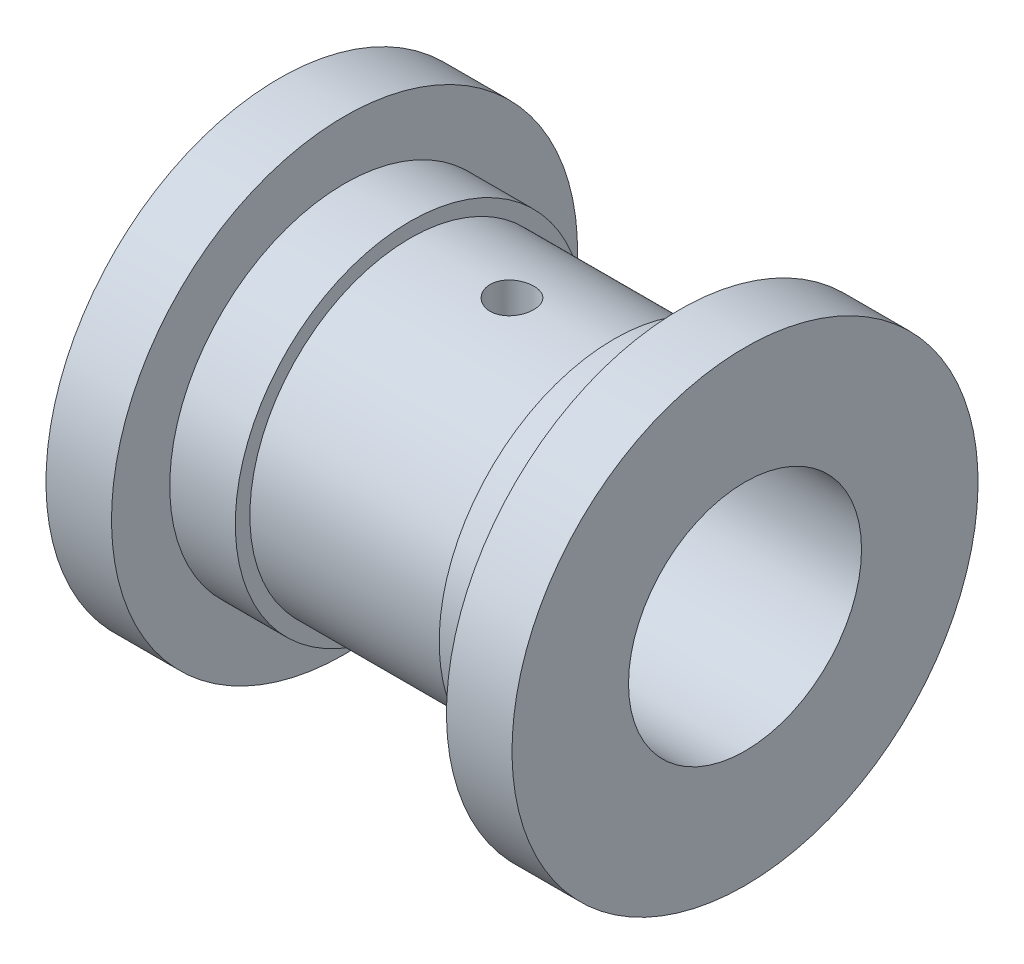
ISO-10303-21;
HEADER;
FILE_DESCRIPTION(('STEP AP214'),'2;1');
FILE_NAME('part.step','',(''),(''),'','','');
FILE_SCHEMA(('AUTOMOTIVE_DESIGN { 1 0 10303 214 1 1 1 1 }'));
ENDSEC;
DATA;
#1=APPLICATION_CONTEXT('core data for automotive mechanical design processes');
#2=APPLICATION_PROTOCOL_DEFINITION('international standard','automotive_design',2000,#1);
#3=PRODUCT_CONTEXT('',#1,'mechanical');
#4=PRODUCT('Part','Part','',(#3));
#5=PRODUCT_RELATED_PRODUCT_CATEGORY('part','',(#4));
#6=PRODUCT_DEFINITION_FORMATION('','',#4);
#7=PRODUCT_DEFINITION_CONTEXT('part definition',#1,'design');
#8=PRODUCT_DEFINITION('design','',#6,#7);
#9=PRODUCT_DEFINITION_SHAPE('','',#8);
#10=(LENGTH_UNIT() NAMED_UNIT(*) SI_UNIT(.MILLI.,.METRE.));
#11=(NAMED_UNIT(*) PLANE_ANGLE_UNIT() SI_UNIT($,.RADIAN.));
#12=(NAMED_UNIT(*) SI_UNIT($,.STERADIAN.) SOLID_ANGLE_UNIT());
#13=UNCERTAINTY_MEASURE_WITH_UNIT(LENGTH_MEASURE(1.E-05),#10,'distance_accuracy_value','');
#14=(GEOMETRIC_REPRESENTATION_CONTEXT(3) GLOBAL_UNCERTAINTY_ASSIGNED_CONTEXT((#13)) GLOBAL_UNIT_ASSIGNED_CONTEXT((#10,
#11,#12)) REPRESENTATION_CONTEXT('',''));
#15=CARTESIAN_POINT('',(0.,0.,0.));
#16=DIRECTION('',(0.,0.,1.));
#17=DIRECTION('',(1.,0.,0.));
#18=AXIS2_PLACEMENT_3D('',#15,#16,#17);
#19=CARTESIAN_POINT('',(-82.8027204836415,0.,0.));
#20=DIRECTION('',(-1.,0.,0.));
#21=DIRECTION('',(0.,-1.,0.));
#22=AXIS2_PLACEMENT_3D('',#19,#20,#21);
#23=CYLINDRICAL_SURFACE('',#22,16.);
#24=CARTESIAN_POINT('',(3.,-16.,0.));
#25=CARTESIAN_POINT('',(2.99999362082345,-15.999996976677,0.166943492930942));
#26=CARTESIAN_POINT('',(2.98601784676124,-15.9973601984342,0.333969985460197));
#27=CARTESIAN_POINT('',(2.93052000976331,-15.9870957178104,0.663316259683595));
#28=CARTESIAN_POINT('',(2.88897469872053,-15.9794638033379,0.825631948304451));
#29=CARTESIAN_POINT('',(2.77965459748132,-15.9600627753091,1.1407459237036));
#30=CARTESIAN_POINT('',(2.71190349509491,-15.9482973989296,1.29355266137069));
#31=CARTESIAN_POINT('',(2.55216224615437,-15.9219142119956,1.58561594618801));
#32=CARTESIAN_POINT('',(2.46017406171036,-15.9072966323658,1.72487358895465));
#33=CARTESIAN_POINT('',(2.25340046399265,-15.87662672861,1.98756743186101));
#34=CARTESIAN_POINT('',(2.13838111065973,-15.860560697127,2.11081791006366));
#35=CARTESIAN_POINT('',(1.88931338182488,-15.828906369173,2.33639212270738));
#36=CARTESIAN_POINT('',(1.75526364046143,-15.8133181070905,2.43871435378483));
#37=CARTESIAN_POINT('',(1.47062782327206,-15.7842510249001,2.62029997331586));
#38=CARTESIAN_POINT('',(1.31991925936553,-15.7707898777236,2.69937443939211));
#39=CARTESIAN_POINT('',(1.00706216964642,-15.7476942642397,2.83101048664566));
#40=CARTESIAN_POINT('',(0.844914631777566,-15.7380594679392,2.88357435426196));
#41=CARTESIAN_POINT('',(0.515769538171177,-15.723845391491,2.96010107007));
#42=CARTESIAN_POINT('',(0.348849805593071,-15.7192089073281,2.98438780384078));
#43=CARTESIAN_POINT('',(0.0132452303835036,-15.7153439430552,3.00467616190693));
#44=CARTESIAN_POINT('',(-0.155439452604603,-15.7161149779752,3.00068032270748));
#45=CARTESIAN_POINT('',(-0.487439050532092,-15.722925854035,2.96477959204725));
#46=CARTESIAN_POINT('',(-0.650795428600308,-15.7288961629466,2.9332429999209));
#47=CARTESIAN_POINT('',(-0.969856839565217,-15.7453236656933,2.84373598792414));
#48=CARTESIAN_POINT('',(-1.1255615470186,-15.7557810501903,2.78576444478999));
#49=CARTESIAN_POINT('',(-1.42597735800053,-15.7800771058517,2.644672943586));
#50=CARTESIAN_POINT('',(-1.57061694116162,-15.7939356764673,2.56140427064912));
#51=CARTESIAN_POINT('',(-1.84400945708047,-15.8234594320583,2.37218737860832));
#52=CARTESIAN_POINT('',(-1.9727607754296,-15.8391248003104,2.26623685778532));
#53=CARTESIAN_POINT('',(-2.21284991134492,-15.8708000254432,2.03267811370595));
#54=CARTESIAN_POINT('',(-2.32388130490348,-15.8868114204806,1.90475487372136));
#55=CARTESIAN_POINT('',(-2.52295448135081,-15.9171477221663,1.63193607419765));
#56=CARTESIAN_POINT('',(-2.61099603374084,-15.9314726119049,1.48704034451154));
#57=CARTESIAN_POINT('',(-2.76163550774003,-15.9568507935501,1.18406997774934));
#58=CARTESIAN_POINT('',(-2.82420155823579,-15.9678999827257,1.02597912889299));
#59=CARTESIAN_POINT('',(-2.92180418618432,-15.9854501080544,0.701278230797393));
#60=CARTESIAN_POINT('',(-2.95684368809071,-15.9919515273598,0.534669088555574));
#61=CARTESIAN_POINT('',(-2.99797206203654,-15.9996072128396,0.20029730580677));
#62=CARTESIAN_POINT('',(-3.00448078305945,-16.0008390182455,0.0325880252682708));
#63=CARTESIAN_POINT('',(-2.9894890409047,-15.9980308719645,-0.301522496184368));
#64=CARTESIAN_POINT('',(-2.96798995386948,-15.9939911792886,-0.46792380096077));
#65=CARTESIAN_POINT('',(-2.89794192963326,-15.9811422300081,-0.793363146436434));
#66=CARTESIAN_POINT('',(-2.84960543492437,-15.9723704474806,-0.952448522092126));
#67=CARTESIAN_POINT('',(-2.72748458644243,-15.9510368442499,-1.26025726364926));
#68=CARTESIAN_POINT('',(-2.65369850486843,-15.9384747662266,-1.40897992519021));
#69=CARTESIAN_POINT('',(-2.48184374368098,-15.9107606071533,-1.69363334302643));
#70=CARTESIAN_POINT('',(-2.38351852292632,-15.8955817234912,-1.82940655403024));
#71=CARTESIAN_POINT('',(-2.16572372527528,-15.8643868697942,-2.08267664652909));
#72=CARTESIAN_POINT('',(-2.04625217399734,-15.8483708216937,-2.20017181952173));
#73=CARTESIAN_POINT('',(-1.78765536217715,-15.817049513949,-2.41514591744096));
#74=CARTESIAN_POINT('',(-1.64829018374923,-15.8017565172051,-2.51233832437153));
#75=CARTESIAN_POINT('',(-1.3549647509525,-15.7738597115706,-2.68193350115574));
#76=CARTESIAN_POINT('',(-1.20100503925905,-15.761255802747,-2.75433719227848));
#77=CARTESIAN_POINT('',(-0.883588265514928,-15.7402604841914,-2.87189347025646));
#78=CARTESIAN_POINT('',(-0.720181240881335,-15.7318488087375,-2.91717737589573));
#79=CARTESIAN_POINT('',(-0.387905554957197,-15.7201440760483,-2.97961358652471));
#80=CARTESIAN_POINT('',(-0.219037512059197,-15.7168504413158,-2.99676906541416));
#81=CARTESIAN_POINT('',(0.116496662883025,-15.7157839960771,-3.00235524296709));
#82=CARTESIAN_POINT('',(0.283155161913991,-15.7179243194858,-2.99123790006998));
#83=CARTESIAN_POINT('',(0.612182844090576,-15.7272920131999,-2.94158350757606));
#84=CARTESIAN_POINT('',(0.774552052854881,-15.7345193531149,-2.90304662178664));
#85=CARTESIAN_POINT('',(1.09014896959096,-15.7532101604636,-2.79983775166526));
#86=CARTESIAN_POINT('',(1.24339318269154,-15.7646656918993,-2.73521470794505));
#87=CARTESIAN_POINT('',(1.53693650848169,-15.7905277510368,-2.58171737824408));
#88=CARTESIAN_POINT('',(1.67723470568956,-15.8049344872024,-2.49284137896371));
#89=CARTESIAN_POINT('',(1.94316736008459,-15.8353453221549,-2.2917897467907));
#90=CARTESIAN_POINT('',(2.06855082513421,-15.8513701070608,-2.17928519728607));
#91=CARTESIAN_POINT('',(2.29881032492905,-15.8830566783747,-1.93485585348458));
#92=CARTESIAN_POINT('',(2.40368164196027,-15.8987183805465,-1.80292660378323));
#93=CARTESIAN_POINT('',(2.59082190525412,-15.9280795193609,-1.52196989014374));
#94=CARTESIAN_POINT('',(2.67287885698128,-15.9417600198112,-1.37279918128103));
#95=CARTESIAN_POINT('',(2.81063527321027,-15.9654323876137,-1.06258022730767));
#96=CARTESIAN_POINT('',(2.86635949409382,-15.9754277175807,-0.901543303410496));
#97=CARTESIAN_POINT('',(2.93855462883735,-15.9885658141526,-0.616694405650307));
#98=CARTESIAN_POINT('',(2.9615572606256,-15.9928294175641,-0.494547620503741));
#99=CARTESIAN_POINT('',(2.99228212423289,-15.9985475990802,-0.248282494230315));
#100=CARTESIAN_POINT('',(3.00000474451181,-16.0000022485961,-0.124164203305418));
#101=CARTESIAN_POINT('',(3.,-16.,0.));
#102=B_SPLINE_CURVE_WITH_KNOTS('',3,(#24,#25,#26,#27,#28,#29,#30,#31,#32,#33,#34,#35,#36,#37,
#38,#39,#40,#41,#42,#43,#44,#45,#46,#47,#48,#49,#50,#51,#52,#53,#54,#55,#56,#57,#58,#59,#60,#61,
#62,#63,#64,#65,#66,#67,#68,#69,#70,#71,#72,#73,#74,#75,#76,#77,#78,#79,#80,#81,#82,#83,#84,#85,
#86,#87,#88,#89,#90,#91,#92,#93,#94,#95,#96,#97,#98,#99,#100,#101),.UNSPECIFIED.,.T.,.F.,(4,2,2,
2,2,2,2,2,2,2,2,2,2,2,2,2,2,2,2,2,2,2,2,2,2,2,2,2,2,2,2,2,2,2,2,2,2,2,4),(0.,0.500376401929848,
1.0011752850709,1.50152254246181,2.00182930673781,2.50750236027261,3.01321172567233,
3.52292381008715,4.03259192623897,4.53636302890672,5.04008895174512,5.53718001225531,
6.03429219693573,6.53438525259061,7.03452908099719,7.54255536928154,8.05058675089895,
8.55925176643397,9.06786273347491,9.56896348152193,10.0700396092917,10.5672046781566,
11.0644035067606,11.5670355603542,12.069714568262,12.579068739746,13.0884039790989,
13.5952525563712,14.1020439389303,14.600785044635,15.0995231708301,15.5973299241539,
16.0951718531085,16.6004673993276,17.1058790252451,17.6158409783263,18.1253225386235,
18.4974868904882,18.8696417807908),.UNSPECIFIED.);
#103=CARTESIAN_POINT('',(3.,-16.,0.));
#104=VERTEX_POINT('',#103);
#105=EDGE_CURVE('E79',#104,#104,#102,.T.);
#106=ORIENTED_EDGE('',*,*,#105,.T.);
#107=EDGE_LOOP('',(#106));
#108=FACE_BOUND('',#107,.T.);
#109=CARTESIAN_POINT('',(0.,15.7162336455017,3.));
#110=CARTESIAN_POINT('',(0.166914416025241,15.7162368759014,2.99999359766589));
#111=CARTESIAN_POINT('',(0.333911896437253,15.7189215952138,2.98602252697898));
#112=CARTESIAN_POINT('',(0.663197923163344,15.7293570202788,2.93054506503584));
#113=CARTESIAN_POINT('',(0.825482352854829,15.7371120234618,2.88901531536947));
#114=CARTESIAN_POINT('',(1.14053014274188,15.7567795292999,2.77974071235582));
#115=CARTESIAN_POINT('',(1.29330221861461,15.7686881581205,2.7120202790875));
#116=CARTESIAN_POINT('',(1.58530711857359,15.7953165264186,2.5523513152073));
#117=CARTESIAN_POINT('',(1.72454099800659,15.8100360465123,2.46040467518386));
#118=CARTESIAN_POINT('',(1.98726039839827,15.840832296779,2.25367357885245));
#119=CARTESIAN_POINT('',(2.11055296694346,15.8569223325136,2.13864585866184));
#120=CARTESIAN_POINT('',(2.33620877919912,15.8885291532806,1.8895435576071));
#121=CARTESIAN_POINT('',(2.43857064884959,15.904045900623,1.75546772724989));
#122=CARTESIAN_POINT('',(2.62019875320103,15.9329003565681,1.47080778914033));
#123=CARTESIAN_POINT('',(2.69928306703884,15.9462205610473,1.32010568006773));
#124=CARTESIAN_POINT('',(2.83093908454706,15.9690321726586,1.00726256650152));
#125=CARTESIAN_POINT('',(2.88351296798044,15.9785238945667,0.845122503719011));
#126=CARTESIAN_POINT('',(2.96005909722227,15.9925151024756,0.516005492374832));
#127=CARTESIAN_POINT('',(2.98435661184537,15.9970713195265,0.349106646489714));
#128=CARTESIAN_POINT('',(3.0046737754008,16.0008736923119,0.0135433520707662));
#129=CARTESIAN_POINT('',(3.00069583227812,16.0001203002139,-0.15512094489534));
#130=CARTESIAN_POINT('',(2.9648244577057,15.9934326752648,-0.487196715798793));
#131=CARTESIAN_POINT('',(2.93328126113998,15.9875634449443,-0.650647520902939));
#132=CARTESIAN_POINT('',(2.84372870120953,15.9713765266712,-0.969894331430951));
#133=CARTESIAN_POINT('',(2.78571837330839,15.9610586765993,-1.12569005765308));
#134=CARTESIAN_POINT('',(2.6445445378834,15.9370252059468,-1.42622013150304));
#135=CARTESIAN_POINT('',(2.56124102417501,15.9232907518165,-1.57088714367707));
#136=CARTESIAN_POINT('',(2.37194866184569,15.893942950857,-1.84431995442927));
#137=CARTESIAN_POINT('',(2.26595750622484,15.8783294130233,-1.97308413382157));
#138=CARTESIAN_POINT('',(2.03236859403294,15.8466702736113,-2.21313123793807));
#139=CARTESIAN_POINT('',(1.90446443219585,15.8306217180324,-2.32411581514082));
#140=CARTESIAN_POINT('',(1.63170093744275,15.8001301784924,-2.52310343702521));
#141=CARTESIAN_POINT('',(1.48684135647073,15.785687218027,-2.61110614542364));
#142=CARTESIAN_POINT('',(1.18388345859468,15.7600378661424,-2.76171704448955));
#143=CARTESIAN_POINT('',(1.02576308561871,15.7488370106052,-2.82428187290843));
#144=CARTESIAN_POINT('',(0.700997631753599,15.7310248479338,-2.92187313950112));
#145=CARTESIAN_POINT('',(0.534353519070433,15.7244130207724,-2.95690269802216));
#146=CARTESIAN_POINT('',(0.199961342288244,15.7166304060201,-2.99799345299478));
#147=CARTESIAN_POINT('',(0.0322677688689722,15.7153791163227,-3.00448328571717));
#148=CARTESIAN_POINT('',(-0.301806910174295,15.7182438284168,-2.98945937763449));
#149=CARTESIAN_POINT('',(-0.468188080296165,15.7223595647722,-2.96794702172866));
#150=CARTESIAN_POINT('',(-0.793505806108774,15.7354196012641,-2.89789736391765));
#151=CARTESIAN_POINT('',(-0.952492505249789,15.7443237338176,-2.84958477167979));
#152=CARTESIAN_POINT('',(-1.26011437946031,15.7659226831324,-2.7275444875812));
#153=CARTESIAN_POINT('',(-1.40874879063066,15.7786177792656,-2.6538149225759));
#154=CARTESIAN_POINT('',(-1.69333523808634,15.8065515572737,-2.4820470623932));
#155=CARTESIAN_POINT('',(-1.82912107573214,15.8218179085063,-2.38373799279242));
#156=CARTESIAN_POINT('',(-2.08242408042866,15.853096227362,-2.16596688688493));
#157=CARTESIAN_POINT('',(-2.19993960311155,15.8691082619299,-2.04650294866167));
#158=CARTESIAN_POINT('',(-2.41496752706825,15.9003324801189,-1.78789883574077));
#159=CARTESIAN_POINT('',(-2.51219165321193,15.9155311166661,-1.64851706819178));
#160=CARTESIAN_POINT('',(-2.68184241235533,15.943188096207,-1.35514904608028));
#161=CARTESIAN_POINT('',(-2.75427000005001,15.9556465446945,-1.20116335407706));
#162=CARTESIAN_POINT('',(-2.87184019572816,15.9763611599169,-0.88375508315737));
#163=CARTESIAN_POINT('',(-2.91712437512282,15.9846390946028,-0.720386426157979));
#164=CARTESIAN_POINT('',(-2.97957409657977,15.9961528416749,-0.388192454763141));
#165=CARTESIAN_POINT('',(-2.99674259732541,15.9993891845988,-0.219367716431697));
#166=CARTESIAN_POINT('',(-3.0023706030369,16.0004445503086,0.116181520501011));
#167=CARTESIAN_POINT('',(-2.9912655062591,15.9983457325,0.282898614132513));
#168=CARTESIAN_POINT('',(-2.94161514446309,15.9891373322347,0.612046738558421));
#169=CARTESIAN_POINT('',(-2.90307014251143,15.9820277978157,0.774477810427461));
#170=CARTESIAN_POINT('',(-2.79981758523272,15.9635967595586,1.09021295119089));
#171=CARTESIAN_POINT('',(-2.73515637423856,15.9522827196228,1.24353263863614));
#172=CARTESIAN_POINT('',(-2.58155909268906,15.9266674413841,1.5372112626337));
#173=CARTESIAN_POINT('',(-2.49262139578454,15.912366002962,1.67756933000769));
#174=CARTESIAN_POINT('',(-2.29149709111754,15.882095597166,1.94351005555884));
#175=CARTESIAN_POINT('',(-2.17899593228479,15.8661056917023,2.06885247077667));
#176=CARTESIAN_POINT('',(-1.93459087500638,15.8343926708998,2.2990307213141));
#177=CARTESIAN_POINT('',(-1.80268241922192,15.8186696191953,2.403861726512));
#178=CARTESIAN_POINT('',(-1.52174709061987,15.7891115480538,2.59095267889405));
#179=CARTESIAN_POINT('',(-1.37257312077141,15.7752953438736,2.67299481058047));
#180=CARTESIAN_POINT('',(-1.06234842014791,15.7513416912985,2.81072264841151));
#181=CARTESIAN_POINT('',(-0.901309066849276,15.7412007725928,2.86643323276462));
#182=CARTESIAN_POINT('',(-0.616495423852269,15.7278603261272,2.9385945319323));
#183=CARTESIAN_POINT('',(-0.494388552471807,15.7235262144357,2.96158211479939));
#184=CARTESIAN_POINT('',(-0.248203063163672,15.7177117118331,2.99228702152192));
#185=CARTESIAN_POINT('',(-0.124124499000656,15.7162312432422,3.00000476104182));
#186=CARTESIAN_POINT('',(0.,15.7162336455017,3.));
#187=B_SPLINE_CURVE_WITH_KNOTS('',3,(#109,#110,#111,#112,#113,#114,#115,#116,#117,#118,#119,
#120,#121,#122,#123,#124,#125,#126,#127,#128,#129,#130,#131,#132,#133,#134,#135,#136,#137,#138,
#139,#140,#141,#142,#143,#144,#145,#146,#147,#148,#149,#150,#151,#152,#153,#154,#155,#156,#157,
#158,#159,#160,#161,#162,#163,#164,#165,#166,#167,#168,#169,#170,#171,#172,#173,#174,#175,#176,
#177,#178,#179,#180,#181,#182,#183,#184,#185,#186),.UNSPECIFIED.,.T.,.F.,(4,2,2,2,2,2,2,2,2,2,2,
2,2,2,2,2,2,2,2,2,2,2,2,2,2,2,2,2,2,2,2,2,2,2,2,2,2,2,4),(0.,0.500289011586373,1.00100260476079,
1.50125045595686,2.00145927987816,2.50724671397382,3.01306734138629,3.52274208696095,
4.03237491879281,4.53608550920522,5.03975320401296,5.53711301197449,6.03449094656849,
6.53467383968438,7.03490761823571,7.54281229528128,8.050724403848,8.55949872236533,
9.06821537732975,9.5692649717415,10.0702897867744,10.5671758463074,11.0640985324863,
11.5667572530829,12.0694611878935,12.5788825099174,13.0882842164341,13.5950053883737,
14.1016732333466,14.6005860114028,15.0994940064433,15.5975205306072,16.0955804271422,
16.6007692801749,17.1060769546153,17.6160600363782,18.1255603150176,18.4976061505795,
18.8696418584437),.UNSPECIFIED.);
#188=CARTESIAN_POINT('',(0.,15.7162336455017,3.));
#189=VERTEX_POINT('',#188);
#190=EDGE_CURVE('E84',#189,#189,#187,.T.);
#191=ORIENTED_EDGE('',*,*,#190,.T.);
#192=EDGE_LOOP('',(#191));
#193=FACE_BOUND('',#192,.T.);
#194=CARTESIAN_POINT('',(32.,0.,0.));
#195=DIRECTION('',(-1.,0.,0.));
#196=DIRECTION('',(0.,-1.,0.));
#197=AXIS2_PLACEMENT_3D('',#194,#195,#196);
#198=CIRCLE('',#197,16.);
#199=CARTESIAN_POINT('',(32.,-16.,0.));
#200=VERTEX_POINT('',#199);
#201=EDGE_CURVE('E76',#200,#200,#198,.T.);
#202=ORIENTED_EDGE('',*,*,#201,.F.);
#203=EDGE_LOOP('',(#202));
#204=FACE_BOUND('',#203,.T.);
#205=CARTESIAN_POINT('',(-32.,0.,0.));
#206=DIRECTION('',(-1.,0.,0.));
#207=DIRECTION('',(0.,-1.,0.));
#208=AXIS2_PLACEMENT_3D('',#205,#206,#207);
#209=CIRCLE('',#208,16.);
#210=CARTESIAN_POINT('',(-32.,-16.,0.));
#211=VERTEX_POINT('',#210);
#212=EDGE_CURVE('E10',#211,#211,#209,.T.);
#213=ORIENTED_EDGE('',*,*,#212,.T.);
#214=EDGE_LOOP('',(#213));
#215=FACE_BOUND('',#214,.T.);
#216=ADVANCED_FACE('F31',(#108,#193,#204,#215),#23,.F.);
#217=CARTESIAN_POINT('',(-32.,16.,0.));
#218=DIRECTION('',(1.,0.,0.));
#219=DIRECTION('',(0.,1.,0.));
#220=AXIS2_PLACEMENT_3D('',#217,#218,#219);
#221=PLANE('',#220);
#222=ORIENTED_EDGE('',*,*,#212,.F.);
#223=EDGE_LOOP('',(#222));
#224=FACE_BOUND('',#223,.T.);
#225=CARTESIAN_POINT('',(-32.,0.,0.));
#226=DIRECTION('',(-1.,0.,0.));
#227=DIRECTION('',(0.,-1.,0.));
#228=AXIS2_PLACEMENT_3D('',#225,#226,#227);
#229=CIRCLE('',#228,32.);
#230=CARTESIAN_POINT('',(-32.,-32.,0.));
#231=VERTEX_POINT('',#230);
#232=EDGE_CURVE('E43',#231,#231,#229,.T.);
#233=ORIENTED_EDGE('',*,*,#232,.T.);
#234=EDGE_LOOP('',(#233));
#235=FACE_BOUND('',#234,.T.);
#236=ADVANCED_FACE('F137',(#224,#235),#221,.F.);
#237=CARTESIAN_POINT('',(-82.8027204836415,0.,0.));
#238=DIRECTION('',(-1.,0.,0.));
#239=DIRECTION('',(0.,-1.,0.));
#240=AXIS2_PLACEMENT_3D('',#237,#238,#239);
#241=CYLINDRICAL_SURFACE('',#240,32.);
#242=ORIENTED_EDGE('',*,*,#232,.F.);
#243=EDGE_LOOP('',(#242));
#244=FACE_BOUND('',#243,.T.);
#245=CARTESIAN_POINT('',(-23.,0.,0.));
#246=DIRECTION('',(-1.,0.,0.));
#247=DIRECTION('',(0.,-1.,0.));
#248=AXIS2_PLACEMENT_3D('',#245,#246,#247);
#249=CIRCLE('',#248,32.);
#250=CARTESIAN_POINT('',(-23.,-32.,0.));
#251=VERTEX_POINT('',#250);
#252=EDGE_CURVE('E47',#251,#251,#249,.T.);
#253=ORIENTED_EDGE('',*,*,#252,.T.);
#254=EDGE_LOOP('',(#253));
#255=FACE_BOUND('',#254,.T.);
#256=ADVANCED_FACE('F134',(#244,#255),#241,.T.);
#257=CARTESIAN_POINT('',(-23.,32.,0.));
#258=DIRECTION('',(-1.,0.,0.));
#259=DIRECTION('',(0.,-1.,0.));
#260=AXIS2_PLACEMENT_3D('',#257,#258,#259);
#261=PLANE('',#260);
#262=ORIENTED_EDGE('',*,*,#252,.F.);
#263=EDGE_LOOP('',(#262));
#264=FACE_BOUND('',#263,.T.);
#265=CARTESIAN_POINT('',(-23.,0.,0.));
#266=DIRECTION('',(-1.,0.,0.));
#267=DIRECTION('',(0.,-1.,0.));
#268=AXIS2_PLACEMENT_3D('',#265,#266,#267);
#269=CIRCLE('',#268,24.);
#270=CARTESIAN_POINT('',(-23.,-24.,0.));
#271=VERTEX_POINT('',#270);
#272=EDGE_CURVE('E52',#271,#271,#269,.T.);
#273=ORIENTED_EDGE('',*,*,#272,.T.);
#274=EDGE_LOOP('',(#273));
#275=FACE_BOUND('',#274,.T.);
#276=ADVANCED_FACE('F130',(#264,#275),#261,.F.);
#277=CARTESIAN_POINT('',(-82.8027204836415,0.,0.));
#278=DIRECTION('',(-1.,0.,0.));
#279=DIRECTION('',(0.,-1.,0.));
#280=AXIS2_PLACEMENT_3D('',#277,#278,#279);
#281=CYLINDRICAL_SURFACE('',#280,24.);
#282=ORIENTED_EDGE('',*,*,#272,.F.);
#283=EDGE_LOOP('',(#282));
#284=FACE_BOUND('',#283,.T.);
#285=CARTESIAN_POINT('',(-14.,0.,0.));
#286=DIRECTION('',(-1.,0.,0.));
#287=DIRECTION('',(0.,-1.,0.));
#288=AXIS2_PLACEMENT_3D('',#285,#286,#287);
#289=CIRCLE('',#288,24.);
#290=CARTESIAN_POINT('',(-14.,-24.,0.));
#291=VERTEX_POINT('',#290);
#292=EDGE_CURVE('E55',#291,#291,#289,.T.);
#293=ORIENTED_EDGE('',*,*,#292,.T.);
#294=EDGE_LOOP('',(#293));
#295=FACE_BOUND('',#294,.T.);
#296=ADVANCED_FACE('F126',(#284,#295),#281,.T.);
#297=CARTESIAN_POINT('',(-14.,24.,0.));
#298=DIRECTION('',(-1.,0.,0.));
#299=DIRECTION('',(0.,-1.,0.));
#300=AXIS2_PLACEMENT_3D('',#297,#298,#299);
#301=PLANE('',#300);
#302=ORIENTED_EDGE('',*,*,#292,.F.);
#303=EDGE_LOOP('',(#302));
#304=FACE_BOUND('',#303,.T.);
#305=CARTESIAN_POINT('',(-14.,0.,0.));
#306=DIRECTION('',(-1.,0.,0.));
#307=DIRECTION('',(0.,-1.,0.));
#308=AXIS2_PLACEMENT_3D('',#305,#306,#307);
#309=CIRCLE('',#308,22.);
#310=CARTESIAN_POINT('',(-14.,-22.,0.));
#311=VERTEX_POINT('',#310);
#312=EDGE_CURVE('E58',#311,#311,#309,.T.);
#313=ORIENTED_EDGE('',*,*,#312,.T.);
#314=EDGE_LOOP('',(#313));
#315=FACE_BOUND('',#314,.T.);
#316=ADVANCED_FACE('F122',(#304,#315),#301,.F.);
#317=CARTESIAN_POINT('',(-82.8027204836415,0.,0.));
#318=DIRECTION('',(-1.,0.,0.));
#319=DIRECTION('',(0.,-1.,0.));
#320=AXIS2_PLACEMENT_3D('',#317,#318,#319);
#321=CYLINDRICAL_SURFACE('',#320,22.);
#322=CARTESIAN_POINT('',(0.,-21.6333076527839,-4.));
#323=CARTESIAN_POINT('',(-0.22268024514592,-21.6333118939645,-3.99999133497668));
#324=CARTESIAN_POINT('',(-0.445474382576009,-21.636783172832,-3.98134200846101));
#325=CARTESIAN_POINT('',(-0.884789231745938,-21.650277261808,-3.907282639324));
#326=CARTESIAN_POINT('',(-1.10130431933857,-21.6603057667963,-3.85184064204138));
#327=CARTESIAN_POINT('',(-1.52164062603702,-21.6857418061113,-3.70594738579437));
#328=CARTESIAN_POINT('',(-1.7254731306161,-21.7011444752347,-3.61552778385547));
#329=CARTESIAN_POINT('',(-2.11505978325792,-21.7355875966023,-3.40232850816631));
#330=CARTESIAN_POINT('',(-2.30081551603275,-21.7546277295313,-3.27955167453961));
#331=CARTESIAN_POINT('',(-2.65116689488351,-21.7944494758656,-3.00359049647932));
#332=CARTESIAN_POINT('',(-2.8155201484679,-21.8152472612912,-2.85010070695621));
#333=CARTESIAN_POINT('',(-3.11629112566885,-21.8560978635286,-2.51773079268323));
#334=CARTESIAN_POINT('',(-3.25270706729076,-21.8761506327525,-2.338849049527));
#335=CARTESIAN_POINT('',(-3.49465463690047,-21.9134244798488,-1.95918683799973));
#336=CARTESIAN_POINT('',(-3.59995853999161,-21.930624292806,-1.75825898095977));
#337=CARTESIAN_POINT('',(-3.77522666605229,-21.9600735467303,-1.34119954887522));
#338=CARTESIAN_POINT('',(-3.84519362101874,-21.97232337038,-1.12506915065336));
#339=CARTESIAN_POINT('',(-3.94705446651091,-21.9903782117666,-0.686249675641717));
#340=CARTESIAN_POINT('',(-3.97935662864144,-21.9962522909049,-0.463658257037537));
#341=CARTESIAN_POINT('',(-4.0062423349248,-22.0011316177892,-0.0161429459318504));
#342=CARTESIAN_POINT('',(-4.00082890714308,-22.0001374169678,0.208780757870075));
#343=CARTESIAN_POINT('',(-3.95275171584416,-21.9914463710422,0.651778392281479));
#344=CARTESIAN_POINT('',(-3.91052749297112,-21.9838286175382,0.869901800106698));
#345=CARTESIAN_POINT('',(-3.79072160507699,-21.9628349381595,1.29591498120673));
#346=CARTESIAN_POINT('',(-3.71313870922753,-21.949458811838,1.5038043979592));
#347=CARTESIAN_POINT('',(-3.52439388044169,-21.9183184074471,1.90473245090769));
#348=CARTESIAN_POINT('',(-3.41305471193233,-21.9005310604676,2.09768578503493));
#349=CARTESIAN_POINT('',(-3.16008822015063,-21.8625379364344,2.46233526714585));
#350=CARTESIAN_POINT('',(-3.01845799412901,-21.8423319276856,2.63402937539644));
#351=CARTESIAN_POINT('',(-2.70650309084144,-21.8013981618568,2.95388890108789));
#352=CARTESIAN_POINT('',(-2.53579396416203,-21.7806670830423,3.10167918809898));
#353=CARTESIAN_POINT('',(-2.17181187215817,-21.7412992413716,3.36658543928332));
#354=CARTESIAN_POINT('',(-1.97853861446949,-21.7226625056581,3.48370100593934));
#355=CARTESIAN_POINT('',(-1.57443497902635,-21.6895894681966,3.68403076498185));
#356=CARTESIAN_POINT('',(-1.36357833672043,-21.6751596002547,3.76719310770445));
#357=CARTESIAN_POINT('',(-0.930565100223265,-21.6522346695387,3.89680753773996));
#358=CARTESIAN_POINT('',(-0.708409706977715,-21.6437389774287,3.94326351793351));
#359=CARTESIAN_POINT('',(-0.262480397589184,-21.6337680818549,3.99760435703092));
#360=CARTESIAN_POINT('',(-0.03877413466073,-21.6321950076555,4.00602696978329));
#361=CARTESIAN_POINT('',(0.406849101122149,-21.6359859030778,3.98550109557699));
#362=CARTESIAN_POINT('',(0.628766156427923,-21.6413495511773,3.95655434071577));
#363=CARTESIAN_POINT('',(1.06276068810456,-21.6583185875735,3.86257219277794));
#364=CARTESIAN_POINT('',(1.27490076801605,-21.6698756001577,3.79781637710752));
#365=CARTESIAN_POINT('',(1.68531943765688,-21.6978878160151,3.63434995143755));
#366=CARTESIAN_POINT('',(1.88359705817135,-21.7143433613545,3.53563697012216));
#367=CARTESIAN_POINT('',(2.26303839203049,-21.7505226830533,3.30581172375987));
#368=CARTESIAN_POINT('',(2.44399223616877,-21.7702800968595,3.17435835883133));
#369=CARTESIAN_POINT('',(2.78146738319551,-21.8107413258404,2.88324609901473));
#370=CARTESIAN_POINT('',(2.93798662399931,-21.8314452207,2.72358482602649));
#371=CARTESIAN_POINT('',(3.22414569229957,-21.8717797209063,2.37819260014522));
#372=CARTESIAN_POINT('',(3.35342471072361,-21.8913936565351,2.19216046504753));
#373=CARTESIAN_POINT('',(3.57889261216599,-21.9270616275553,1.80070523958706));
#374=CARTESIAN_POINT('',(3.67508271455434,-21.9431157941211,1.5952828641357));
#375=CARTESIAN_POINT('',(3.83109607727288,-21.9697834526314,1.17189643669069));
#376=CARTESIAN_POINT('',(3.89109980975306,-21.9804239020959,0.954000658707902));
#377=CARTESIAN_POINT('',(3.97361468659431,-21.9951799495618,0.51101329792696));
#378=CARTESIAN_POINT('',(3.99612953027341,-21.9992961913553,0.285922427358462));
#379=CARTESIAN_POINT('',(4.00290504221103,-22.0005282842775,-0.161599238057634));
#380=CARTESIAN_POINT('',(3.98771177696937,-21.9977440646224,-0.384021675850895));
#381=CARTESIAN_POINT('',(3.92069410715213,-21.9856946780428,-0.823089077981734));
#382=CARTESIAN_POINT('',(3.86887000960198,-21.9764295654387,-1.03973409072766));
#383=CARTESIAN_POINT('',(3.73028619302147,-21.9524581381545,-1.46083086688086));
#384=CARTESIAN_POINT('',(3.64358130924888,-21.9377603669599,-1.6653011932924));
#385=CARTESIAN_POINT('',(3.43776119438248,-21.9045184478405,-2.05687402388434));
#386=CARTESIAN_POINT('',(3.31864396744516,-21.8859740630709,-2.24397545759469));
#387=CARTESIAN_POINT('',(3.04948472287622,-21.8467718041457,-2.59822919507097));
#388=CARTESIAN_POINT('',(2.89904660923133,-21.826088758947,-2.76507779716897));
#389=CARTESIAN_POINT('',(2.57234096661293,-21.7851034058444,-3.07135244710173));
#390=CARTESIAN_POINT('',(2.39606738287678,-21.7648011884523,-3.21077204872679));
#391=CARTESIAN_POINT('',(2.02088064879777,-21.7266856567863,-3.45935343607217));
#392=CARTESIAN_POINT('',(1.8217855213773,-21.7088952940926,-3.56824417003713));
#393=CARTESIAN_POINT('',(1.40787344654803,-21.6780923491353,-3.75086117813966));
#394=CARTESIAN_POINT('',(1.19307181678437,-21.6650751844592,-3.82462119925559));
#395=CARTESIAN_POINT('',(0.814646631135489,-21.6480562150114,-3.91959792411038));
#396=CARTESIAN_POINT('',(0.65326147478277,-21.642557744208,-3.94969798379532));
#397=CARTESIAN_POINT('',(0.327938095935634,-21.6351819455147,-3.98990196850047));
#398=CARTESIAN_POINT('',(0.163999935860683,-21.6333045292318,-4.00000638163151));
#399=CARTESIAN_POINT('',(0.,-21.6333076527839,-4.));
#400=B_SPLINE_CURVE_WITH_KNOTS('',3,(#322,#323,#324,#325,#326,#327,#328,#329,#330,#331,#332,
#333,#334,#335,#336,#337,#338,#339,#340,#341,#342,#343,#344,#345,#346,#347,#348,#349,#350,#351,
#352,#353,#354,#355,#356,#357,#358,#359,#360,#361,#362,#363,#364,#365,#366,#367,#368,#369,#370,
#371,#372,#373,#374,#375,#376,#377,#378,#379,#380,#381,#382,#383,#384,#385,#386,#387,#388,#389,
#390,#391,#392,#393,#394,#395,#396,#397,#398,#399),.UNSPECIFIED.,.T.,.F.,(4,2,2,2,2,2,2,2,2,2,2,
2,2,2,2,2,2,2,2,2,2,2,2,2,2,2,2,2,2,2,2,2,2,2,2,2,2,2,4),(0.,0.667440705257541,1.33546184685072,
2.00287979476302,2.67023918023371,3.34459870230519,4.01900122532956,4.69822425023956,
5.37739475450279,6.04913278831927,6.7208168910346,7.38458890585933,8.04838402822076,
8.71572656975959,9.38313309046882,10.0601670169629,10.7372097167831,11.4152824897346,
12.0932833402558,12.7616672929396,13.4300202666519,14.0932273132435,14.7564806826868,
15.4269564046825,16.0974886789026,16.7764104513919,17.4553072020415,18.1307894735074,
18.8062050859725,19.4718969577386,20.1375832499996,20.8022270968081,21.4669118794232,
22.1405775941432,22.8144014413677,23.4940309659145,24.1730063069362,24.6645762030324,
25.1561340993393),.UNSPECIFIED.);
#401=CARTESIAN_POINT('',(0.,-21.6333076527839,-4.));
#402=VERTEX_POINT('',#401);
#403=EDGE_CURVE('E185',#402,#402,#400,.T.);
#404=ORIENTED_EDGE('',*,*,#403,.T.);
#405=EDGE_LOOP('',(#404));
#406=FACE_BOUND('',#405,.T.);
#407=CARTESIAN_POINT('',(0.,21.7944947177034,3.));
#408=CARTESIAN_POINT('',(-0.167668655793932,21.7944973125222,2.99999295397829));
#409=CARTESIAN_POINT('',(-0.335438885571998,21.7964504822141,2.98589613516892));
#410=CARTESIAN_POINT('',(-0.666300949403409,21.8040481680046,2.92988930626152));
#411=CARTESIAN_POINT('',(-0.829387860056514,21.8096964302678,2.88795106929477));
#412=CARTESIAN_POINT('',(-1.14604557101637,21.8240329226108,2.77752885626791));
#413=CARTESIAN_POINT('',(-1.29962310318679,21.8327189725423,2.70906391400626));
#414=CARTESIAN_POINT('',(-1.59308393749803,21.8521497354893,2.54757436301586));
#415=CARTESIAN_POINT('',(-1.73296937813151,21.8628941262462,2.4545535979434));
#416=CARTESIAN_POINT('',(-1.99602918996938,21.8853107439761,2.24593261550096));
#417=CARTESIAN_POINT('',(-2.11909952067151,21.8969880962733,2.13020174404838));
#418=CARTESIAN_POINT('',(-2.34413561137157,21.9199089625179,1.87972745186893));
#419=CARTESIAN_POINT('',(-2.44610027468495,21.9311524538967,1.74498304377951));
#420=CARTESIAN_POINT('',(-2.62640880979332,21.9519917823356,1.45964673364285));
#421=CARTESIAN_POINT('',(-2.70465775314384,21.9615809332171,1.30899431491147));
#422=CARTESIAN_POINT('',(-2.83470513621747,21.9779746087792,0.996533559622196));
#423=CARTESIAN_POINT('',(-2.88650473676131,21.9847792556648,0.834725713012597));
#424=CARTESIAN_POINT('',(-2.96187006393193,21.9948010960819,0.505615027627407));
#425=CARTESIAN_POINT('',(-2.98560939170287,21.9980403391051,0.338352625202421));
#426=CARTESIAN_POINT('',(-3.00471876192815,22.0006418160325,0.00218901989865313));
#427=CARTESIAN_POINT('',(-3.00009012009931,22.0000042297454,-0.16671210661274));
#428=CARTESIAN_POINT('',(-2.96273314482718,21.9949416293269,-0.50017613409549));
#429=CARTESIAN_POINT('',(-2.93019154096829,21.9905417842193,-0.664760389901238));
#430=CARTESIAN_POINT('',(-2.83822479796853,21.9784771616625,-0.986109968659579));
#431=CARTESIAN_POINT('',(-2.77879906739158,21.9708123123852,-1.1428751195119));
#432=CARTESIAN_POINT('',(-2.63455559502031,21.9530355245634,-1.44470900216683));
#433=CARTESIAN_POINT('',(-2.54965799841275,21.9429159096715,-1.58973910165001));
#434=CARTESIAN_POINT('',(-2.35693890109396,21.9213599095811,-1.86356465940336));
#435=CARTESIAN_POINT('',(-2.24911615051487,21.9099234526045,-1.99235923191069));
#436=CARTESIAN_POINT('',(-2.01256398815935,21.8869019715346,-2.23115639122851));
#437=CARTESIAN_POINT('',(-1.88367170498197,21.8753164955576,-2.34099765683572));
#438=CARTESIAN_POINT('',(-1.60919608132634,21.8533940433535,-2.53751386076589));
#439=CARTESIAN_POINT('',(-1.46361266894255,21.8430570725053,-2.62418869928229));
#440=CARTESIAN_POINT('',(-1.15973309839801,21.8248023099056,-2.77192629130127));
#441=CARTESIAN_POINT('',(-1.00142980323137,21.816885888441,-2.83297454471217));
#442=CARTESIAN_POINT('',(-0.67668593885512,21.8043941534575,-2.92757469616753));
#443=CARTESIAN_POINT('',(-0.510245840045062,21.7998186470391,-2.96112818173423));
#444=CARTESIAN_POINT('',(-0.17538231298618,21.7945626889125,-2.99956941672119));
#445=CARTESIAN_POINT('',(-0.00698549676102025,21.7938512929769,-3.00468490854897));
#446=CARTESIAN_POINT('',(0.328262835866351,21.7963221316711,-2.98670732293099));
#447=CARTESIAN_POINT('',(0.49511439154408,21.7995042670648,-2.96361496443094));
#448=CARTESIAN_POINT('',(0.821843465157792,21.8093753071634,-2.89006955453774));
#449=CARTESIAN_POINT('',(0.981746585492375,21.8160498979624,-2.83972815512375));
#450=CARTESIAN_POINT('',(1.29084344925947,21.8321421092609,-2.71322912313733));
#451=CARTESIAN_POINT('',(1.44003674919157,21.8415598432741,-2.63707042220062));
#452=CARTESIAN_POINT('',(1.72450521244539,21.8621508077798,-2.46054424209315));
#453=CARTESIAN_POINT('',(1.85968743225274,21.8733346554527,-2.36002824545062));
#454=CARTESIAN_POINT('',(2.11134500486865,21.8961649833416,-2.13784918546698));
#455=CARTESIAN_POINT('',(2.22781948780176,21.9078114850387,-2.01618513932771));
#456=CARTESIAN_POINT('',(2.43956305361874,21.9303506440045,-1.75416517490271));
#457=CARTESIAN_POINT('',(2.53468192892496,21.9412376115705,-1.61368731048535));
#458=CARTESIAN_POINT('',(2.6999717780776,21.9609445601932,-1.31861563564173));
#459=CARTESIAN_POINT('',(2.77014333476205,21.9697645895377,-1.1640221551012));
#460=CARTESIAN_POINT('',(2.88330205185705,21.9843187797623,-0.845593617063881));
#461=CARTESIAN_POINT('',(2.92637398729285,21.9900625555325,-0.681789143548596));
#462=CARTESIAN_POINT('',(2.98438601535222,21.9978571930975,-0.349189125621002));
#463=CARTESIAN_POINT('',(2.99932763043927,21.9999082547485,-0.180393851822023));
#464=CARTESIAN_POINT('',(3.00062266554247,22.0000849669784,0.155933944793779));
#465=CARTESIAN_POINT('',(2.98720691376543,21.9982423123403,0.323465608546992));
#466=CARTESIAN_POINT('',(2.93265946872278,21.9909020074537,0.653868527504439));
#467=CARTESIAN_POINT('',(2.89152782222594,21.9854043633727,0.816739790572315));
#468=CARTESIAN_POINT('',(2.78279281440876,21.9713688879314,1.13315387765859));
#469=CARTESIAN_POINT('',(2.71520266767052,21.9628325744139,1.28670131426867));
#470=CARTESIAN_POINT('',(2.55549339551869,21.9436616719154,1.58031159285156));
#471=CARTESIAN_POINT('',(2.46337375671112,21.9330270390184,1.72037415250691));
#472=CARTESIAN_POINT('',(2.25637442655637,21.9107413064255,1.98421472860386));
#473=CARTESIAN_POINT('',(2.14132346408358,21.899082951343,2.10785776937319));
#474=CARTESIAN_POINT('',(1.89208624401361,21.8761200052605,2.33416948478685));
#475=CARTESIAN_POINT('',(1.75789548220963,21.864815498298,2.43683320845295));
#476=CARTESIAN_POINT('',(1.47347030664266,21.8437846234674,2.61868613380124));
#477=CARTESIAN_POINT('',(1.32316490840222,21.8340657568726,2.69776514213643));
#478=CARTESIAN_POINT('',(1.01135241536029,21.817394367016,2.8294429199818));
#479=CARTESIAN_POINT('',(0.849857473558311,21.8104388960614,2.8820699216208));
#480=CARTESIAN_POINT('',(0.572977203513978,21.8017355288375,2.94703203226377));
#481=CARTESIAN_POINT('',(0.459323577603178,21.7990341203125,2.96686567785599));
#482=CARTESIAN_POINT('',(0.230462622878614,21.7954128315745,2.99335201931175));
#483=CARTESIAN_POINT('',(0.115255309193853,21.7944929340268,3.00000484343008));
#484=CARTESIAN_POINT('',(0.,21.7944947177034,3.));
#485=B_SPLINE_CURVE_WITH_KNOTS('',3,(#407,#408,#409,#410,#411,#412,#413,#414,#415,#416,#417,
#418,#419,#420,#421,#422,#423,#424,#425,#426,#427,#428,#429,#430,#431,#432,#433,#434,#435,#436,
#437,#438,#439,#440,#441,#442,#443,#444,#445,#446,#447,#448,#449,#450,#451,#452,#453,#454,#455,
#456,#457,#458,#459,#460,#461,#462,#463,#464,#465,#466,#467,#468,#469,#470,#471,#472,#473,#474,
#475,#476,#477,#478,#479,#480,#481,#482,#483,#484),.UNSPECIFIED.,.T.,.F.,(4,2,2,2,2,2,2,2,2,2,2,
2,2,2,2,2,2,2,2,2,2,2,2,2,2,2,2,2,2,2,2,2,2,2,2,2,2,2,4),(0.,0.502584827322537,1.00567997726412,
1.50841480614355,2.01107098991681,2.5167086035308,3.02237248429928,3.53003447052541,
4.03767417433728,4.54215653413514,5.04661549603351,5.54772586150296,6.04884725166254,
6.55155638132181,7.05429292546104,7.56111742626901,8.06794411056386,8.57505718337533,
9.08214097388763,9.58515792757104,10.0881620609109,10.5891205844915,11.0900998411272,
11.5942142584276,12.0983521093423,12.6059319233779,13.1134998781727,13.6194720220333,
14.125416780985,14.6272590296531,15.1291004314969,15.6306915099824,16.1322930874247,
16.6377918045005,17.1434096784681,17.6513541852326,18.158755407386,18.5042352052812,
18.8497116414995),.UNSPECIFIED.);
#486=CARTESIAN_POINT('',(0.,21.7944947177034,3.));
#487=VERTEX_POINT('',#486);
#488=EDGE_CURVE('E35',#487,#487,#485,.T.);
#489=ORIENTED_EDGE('',*,*,#488,.T.);
#490=EDGE_LOOP('',(#489));
#491=FACE_BOUND('',#490,.T.);
#492=ORIENTED_EDGE('',*,*,#312,.F.);
#493=EDGE_LOOP('',(#492));
#494=FACE_BOUND('',#493,.T.);
#495=CARTESIAN_POINT('',(14.,0.,0.));
#496=DIRECTION('',(-1.,0.,0.));
#497=DIRECTION('',(0.,-1.,0.));
#498=AXIS2_PLACEMENT_3D('',#495,#496,#497);
#499=CIRCLE('',#498,22.);
#500=CARTESIAN_POINT('',(14.,-22.,0.));
#501=VERTEX_POINT('',#500);
#502=EDGE_CURVE('E61',#501,#501,#499,.T.);
#503=ORIENTED_EDGE('',*,*,#502,.T.);
#504=EDGE_LOOP('',(#503));
#505=FACE_BOUND('',#504,.T.);
#506=ADVANCED_FACE('F117',(#406,#491,#494,#505),#321,.T.);
#507=CARTESIAN_POINT('',(14.,22.,0.));
#508=DIRECTION('',(1.,0.,0.));
#509=DIRECTION('',(0.,1.,0.));
#510=AXIS2_PLACEMENT_3D('',#507,#508,#509);
#511=PLANE('',#510);
#512=ORIENTED_EDGE('',*,*,#502,.F.);
#513=EDGE_LOOP('',(#512));
#514=FACE_BOUND('',#513,.T.);
#515=CARTESIAN_POINT('',(14.,0.,0.));
#516=DIRECTION('',(-1.,0.,0.));
#517=DIRECTION('',(0.,-1.,0.));
#518=AXIS2_PLACEMENT_3D('',#515,#516,#517);
#519=CIRCLE('',#518,24.);
#520=CARTESIAN_POINT('',(14.,-24.,0.));
#521=VERTEX_POINT('',#520);
#522=EDGE_CURVE('E64',#521,#521,#519,.T.);
#523=ORIENTED_EDGE('',*,*,#522,.T.);
#524=EDGE_LOOP('',(#523));
#525=FACE_BOUND('',#524,.T.);
#526=ADVANCED_FACE('F114',(#514,#525),#511,.F.);
#527=CARTESIAN_POINT('',(-82.8027204836415,0.,0.));
#528=DIRECTION('',(-1.,0.,0.));
#529=DIRECTION('',(0.,-1.,0.));
#530=AXIS2_PLACEMENT_3D('',#527,#528,#529);
#531=CYLINDRICAL_SURFACE('',#530,24.);
#532=ORIENTED_EDGE('',*,*,#522,.F.);
#533=EDGE_LOOP('',(#532));
#534=FACE_BOUND('',#533,.T.);
#535=CARTESIAN_POINT('',(23.,0.,0.));
#536=DIRECTION('',(-1.,0.,0.));
#537=DIRECTION('',(0.,-1.,0.));
#538=AXIS2_PLACEMENT_3D('',#535,#536,#537);
#539=CIRCLE('',#538,24.);
#540=CARTESIAN_POINT('',(23.,-24.,0.));
#541=VERTEX_POINT('',#540);
#542=EDGE_CURVE('E67',#541,#541,#539,.T.);
#543=ORIENTED_EDGE('',*,*,#542,.T.);
#544=EDGE_LOOP('',(#543));
#545=FACE_BOUND('',#544,.T.);
#546=ADVANCED_FACE('F110',(#534,#545),#531,.T.);
#547=CARTESIAN_POINT('',(23.,24.,0.));
#548=DIRECTION('',(1.,0.,0.));
#549=DIRECTION('',(0.,1.,0.));
#550=AXIS2_PLACEMENT_3D('',#547,#548,#549);
#551=PLANE('',#550);
#552=ORIENTED_EDGE('',*,*,#542,.F.);
#553=EDGE_LOOP('',(#552));
#554=FACE_BOUND('',#553,.T.);
#555=CARTESIAN_POINT('',(23.,0.,0.));
#556=DIRECTION('',(-1.,0.,0.));
#557=DIRECTION('',(0.,-1.,0.));
#558=AXIS2_PLACEMENT_3D('',#555,#556,#557);
#559=CIRCLE('',#558,32.);
#560=CARTESIAN_POINT('',(23.,-32.,0.));
#561=VERTEX_POINT('',#560);
#562=EDGE_CURVE('E70',#561,#561,#559,.T.);
#563=ORIENTED_EDGE('',*,*,#562,.T.);
#564=EDGE_LOOP('',(#563));
#565=FACE_BOUND('',#564,.T.);
#566=ADVANCED_FACE('F106',(#554,#565),#551,.F.);
#567=CARTESIAN_POINT('',(-82.8027204836415,0.,0.));
#568=DIRECTION('',(-1.,0.,0.));
#569=DIRECTION('',(0.,-1.,0.));
#570=AXIS2_PLACEMENT_3D('',#567,#568,#569);
#571=CYLINDRICAL_SURFACE('',#570,32.);
#572=ORIENTED_EDGE('',*,*,#562,.F.);
#573=EDGE_LOOP('',(#572));
#574=FACE_BOUND('',#573,.T.);
#575=CARTESIAN_POINT('',(32.,0.,0.));
#576=DIRECTION('',(-1.,0.,0.));
#577=DIRECTION('',(0.,-1.,0.));
#578=AXIS2_PLACEMENT_3D('',#575,#576,#577);
#579=CIRCLE('',#578,32.);
#580=CARTESIAN_POINT('',(32.,-32.,0.));
#581=VERTEX_POINT('',#580);
#582=EDGE_CURVE('E73',#581,#581,#579,.T.);
#583=ORIENTED_EDGE('',*,*,#582,.T.);
#584=EDGE_LOOP('',(#583));
#585=FACE_BOUND('',#584,.T.);
#586=ADVANCED_FACE('F102',(#574,#585),#571,.T.);
#587=CARTESIAN_POINT('',(32.,32.,0.));
#588=DIRECTION('',(-1.,0.,0.));
#589=DIRECTION('',(0.,-1.,0.));
#590=AXIS2_PLACEMENT_3D('',#587,#588,#589);
#591=PLANE('',#590);
#592=ORIENTED_EDGE('',*,*,#582,.F.);
#593=EDGE_LOOP('',(#592));
#594=FACE_BOUND('',#593,.T.);
#595=ORIENTED_EDGE('',*,*,#201,.T.);
#596=EDGE_LOOP('',(#595));
#597=FACE_BOUND('',#596,.T.);
#598=ADVANCED_FACE('F97',(#594,#597),#591,.F.);
#599=CARTESIAN_POINT('',(0.,-32.,0.));
#600=DIRECTION('',(0.,1.,0.));
#601=DIRECTION('',(0.,0.,1.));
#602=AXIS2_PLACEMENT_3D('',#599,#600,#601);
#603=CYLINDRICAL_SURFACE('',#602,3.);
#604=ORIENTED_EDGE('',*,*,#488,.F.);
#605=EDGE_LOOP('',(#604));
#606=FACE_BOUND('',#605,.T.);
#607=ORIENTED_EDGE('',*,*,#190,.F.);
#608=EDGE_LOOP('',(#607));
#609=FACE_BOUND('',#608,.T.);
#610=ADVANCED_FACE('F94',(#606,#609),#603,.F.);
#611=ORIENTED_EDGE('',*,*,#105,.F.);
#612=EDGE_LOOP('',(#611));
#613=FACE_BOUND('',#612,.T.);
#614=CARTESIAN_POINT('',(0.,-30.,0.));
#615=DIRECTION('',(0.,1.,0.));
#616=DIRECTION('',(0.,0.,1.));
#617=AXIS2_PLACEMENT_3D('',#614,#615,#616);
#618=CIRCLE('',#617,3.);
#619=CARTESIAN_POINT('',(0.,-30.,3.));
#620=VERTEX_POINT('',#619);
#621=EDGE_CURVE('E181',#620,#620,#618,.T.);
#622=ORIENTED_EDGE('',*,*,#621,.F.);
#623=EDGE_LOOP('',(#622));
#624=FACE_BOUND('',#623,.T.);
#625=ADVANCED_FACE('F88',(#613,#624),#603,.F.);
#626=CARTESIAN_POINT('',(0.,-30.,0.));
#627=DIRECTION('',(0.,1.,0.));
#628=DIRECTION('',(0.,0.,1.));
#629=AXIS2_PLACEMENT_3D('',#626,#627,#628);
#630=CYLINDRICAL_SURFACE('',#629,4.);
#631=CARTESIAN_POINT('',(0.,-30.,0.));
#632=DIRECTION('',(0.,1.,0.));
#633=DIRECTION('',(0.,0.,1.));
#634=AXIS2_PLACEMENT_3D('',#631,#632,#633);
#635=CIRCLE('',#634,4.);
#636=CARTESIAN_POINT('',(0.,-30.,4.));
#637=VERTEX_POINT('',#636);
#638=EDGE_CURVE('E177',#637,#637,#635,.T.);
#639=ORIENTED_EDGE('',*,*,#638,.T.);
#640=EDGE_LOOP('',(#639));
#641=FACE_BOUND('',#640,.T.);
#642=ORIENTED_EDGE('',*,*,#403,.F.);
#643=EDGE_LOOP('',(#642));
#644=FACE_BOUND('',#643,.T.);
#645=ADVANCED_FACE('F93',(#641,#644),#630,.T.);
#646=CARTESIAN_POINT('',(0.,-30.,0.));
#647=DIRECTION('',(0.,1.,0.));
#648=DIRECTION('',(0.,0.,1.));
#649=AXIS2_PLACEMENT_3D('',#646,#647,#648);
#650=PLANE('',#649);
#651=ORIENTED_EDGE('',*,*,#621,.T.);
#652=EDGE_LOOP('',(#651));
#653=FACE_BOUND('',#652,.T.);
#654=ORIENTED_EDGE('',*,*,#638,.F.);
#655=EDGE_LOOP('',(#654));
#656=FACE_BOUND('',#655,.T.);
#657=ADVANCED_FACE('F195',(#653,#656),#650,.F.);
#658=CLOSED_SHELL('',(#216,#236,#256,#276,#296,#316,#506,#526,#546,#566,#586,#598,#610,#625,
#645,#657));
#659=MANIFOLD_SOLID_BREP('B2',#658);
#660=ADVANCED_BREP_SHAPE_REPRESENTATION('',(#18,#659),#14);
#661=SHAPE_DEFINITION_REPRESENTATION(#9,#660);
ENDSEC;
END-ISO-10303-21;
